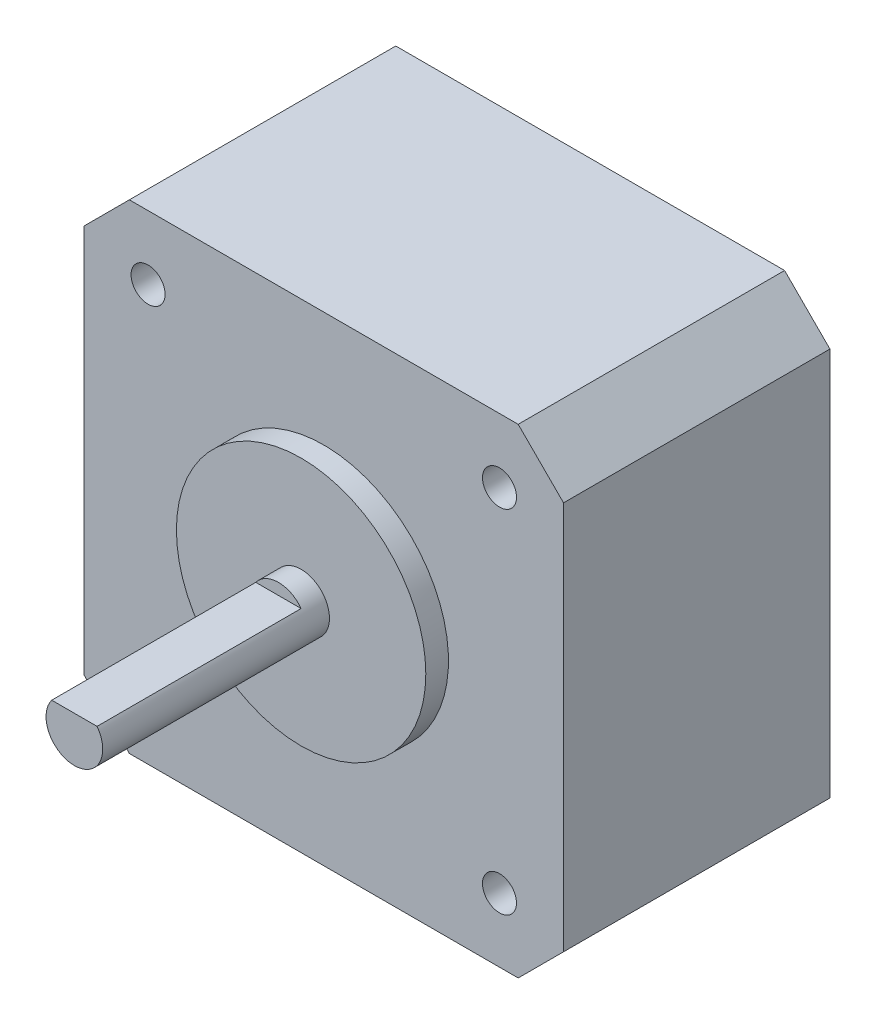
ISO-10303-21;
HEADER;
FILE_DESCRIPTION(('STEP AP214'),'2;1');
FILE_NAME('part.step','',(''),(''),'','','');
FILE_SCHEMA(('AUTOMOTIVE_DESIGN { 1 0 10303 214 1 1 1 1 }'));
ENDSEC;
DATA;
#1=APPLICATION_CONTEXT('core data for automotive mechanical design processes');
#2=APPLICATION_PROTOCOL_DEFINITION('international standard','automotive_design',2000,#1);
#3=PRODUCT_CONTEXT('',#1,'mechanical');
#4=PRODUCT('Part','Part','',(#3));
#5=PRODUCT_RELATED_PRODUCT_CATEGORY('part','',(#4));
#6=PRODUCT_DEFINITION_FORMATION('','',#4);
#7=PRODUCT_DEFINITION_CONTEXT('part definition',#1,'design');
#8=PRODUCT_DEFINITION('design','',#6,#7);
#9=PRODUCT_DEFINITION_SHAPE('','',#8);
#10=(LENGTH_UNIT() NAMED_UNIT(*) SI_UNIT(.MILLI.,.METRE.));
#11=(NAMED_UNIT(*) PLANE_ANGLE_UNIT() SI_UNIT($,.RADIAN.));
#12=(NAMED_UNIT(*) SI_UNIT($,.STERADIAN.) SOLID_ANGLE_UNIT());
#13=UNCERTAINTY_MEASURE_WITH_UNIT(LENGTH_MEASURE(1.E-05),#10,'distance_accuracy_value','');
#14=(GEOMETRIC_REPRESENTATION_CONTEXT(3) GLOBAL_UNCERTAINTY_ASSIGNED_CONTEXT((#13)) GLOBAL_UNIT_ASSIGNED_CONTEXT((#10,
#11,#12)) REPRESENTATION_CONTEXT('',''));
#15=CARTESIAN_POINT('',(0.,0.,0.));
#16=DIRECTION('',(0.,0.,1.));
#17=DIRECTION('',(1.,0.,0.));
#18=AXIS2_PLACEMENT_3D('',#15,#16,#17);
#19=CARTESIAN_POINT('',(0.,0.,45.5));
#20=DIRECTION('',(0.,0.,-1.));
#21=DIRECTION('',(-1.,0.,0.));
#22=AXIS2_PLACEMENT_3D('',#19,#20,#21);
#23=CYLINDRICAL_SURFACE('',#22,2.5);
#24=CARTESIAN_POINT('',(0.,0.,25.5));
#25=DIRECTION('',(0.,0.,1.));
#26=DIRECTION('',(1.,0.,0.));
#27=AXIS2_PLACEMENT_3D('',#24,#25,#26);
#28=CIRCLE('',#27,2.5);
#29=CARTESIAN_POINT('',(2.5,0.,25.5));
#30=VERTEX_POINT('',#29);
#31=EDGE_CURVE('E145',#30,#30,#28,.T.);
#32=ORIENTED_EDGE('',*,*,#31,.T.);
#33=EDGE_LOOP('',(#32));
#34=FACE_BOUND('',#33,.T.);
#35=DIRECTION('',(0.,0.,-1.));
#36=VECTOR('',#35,1.);
#37=CARTESIAN_POINT('',(-2.,1.5,45.5));
#38=LINE('',#37,#36);
#39=CARTESIAN_POINT('',(-2.,1.5,27.5));
#40=VERTEX_POINT('',#39);
#41=CARTESIAN_POINT('',(-2.,1.5,45.5));
#42=VERTEX_POINT('',#41);
#43=EDGE_CURVE('E54',#40,#42,#38,.F.);
#44=ORIENTED_EDGE('',*,*,#43,.F.);
#45=CARTESIAN_POINT('',(0.,0.,27.5));
#46=DIRECTION('',(0.,0.,-1.));
#47=DIRECTION('',(-1.,0.,0.));
#48=AXIS2_PLACEMENT_3D('',#45,#46,#47);
#49=CIRCLE('',#48,2.5);
#50=CARTESIAN_POINT('',(2.,1.5,27.5));
#51=VERTEX_POINT('',#50);
#52=EDGE_CURVE('E11',#40,#51,#49,.T.);
#53=ORIENTED_EDGE('',*,*,#52,.T.);
#54=DIRECTION('',(0.,0.,-1.));
#55=VECTOR('',#54,1.);
#56=CARTESIAN_POINT('',(2.,1.5,45.5));
#57=LINE('',#56,#55);
#58=CARTESIAN_POINT('',(2.,1.5,45.5));
#59=VERTEX_POINT('',#58);
#60=EDGE_CURVE('E140',#59,#51,#57,.T.);
#61=ORIENTED_EDGE('',*,*,#60,.F.);
#62=CARTESIAN_POINT('',(0.,0.,45.5));
#63=DIRECTION('',(0.,0.,1.));
#64=DIRECTION('',(1.,0.,0.));
#65=AXIS2_PLACEMENT_3D('',#62,#63,#64);
#66=CIRCLE('',#65,2.5);
#67=EDGE_CURVE('E147',#42,#59,#66,.T.);
#68=ORIENTED_EDGE('',*,*,#67,.F.);
#69=EDGE_LOOP('',(#44,#53,#61,#68));
#70=FACE_BOUND('',#69,.T.);
#71=ADVANCED_FACE('F39',(#34,#70),#23,.T.);
#72=CARTESIAN_POINT('',(0.,0.,45.5));
#73=DIRECTION('',(0.,0.,1.));
#74=DIRECTION('',(1.,0.,0.));
#75=AXIS2_PLACEMENT_3D('',#72,#73,#74);
#76=PLANE('',#75);
#77=ORIENTED_EDGE('',*,*,#67,.T.);
#78=DIRECTION('',(-1.,0.,0.));
#79=VECTOR('',#78,1.);
#80=CARTESIAN_POINT('',(0.,1.5,45.5));
#81=LINE('',#80,#79);
#82=EDGE_CURVE('E47',#59,#42,#81,.T.);
#83=ORIENTED_EDGE('',*,*,#82,.T.);
#84=EDGE_LOOP('',(#77,#83));
#85=FACE_BOUND('',#84,.T.);
#86=ADVANCED_FACE('F149',(#85),#76,.T.);
#87=CARTESIAN_POINT('',(-17.15,-21.15,23.5));
#88=DIRECTION('',(0.,1.,0.));
#89=DIRECTION('',(0.,0.,1.));
#90=AXIS2_PLACEMENT_3D('',#87,#88,#89);
#91=PLANE('',#90);
#92=DIRECTION('',(0.,0.,-1.));
#93=VECTOR('',#92,1.);
#94=CARTESIAN_POINT('',(-8.1,-21.15,0.));
#95=LINE('',#94,#93);
#96=CARTESIAN_POINT('',(-8.1,-21.15,9.2));
#97=VERTEX_POINT('',#96);
#98=CARTESIAN_POINT('',(-8.1,-21.15,0.));
#99=VERTEX_POINT('',#98);
#100=EDGE_CURVE('E62',#97,#99,#95,.T.);
#101=ORIENTED_EDGE('',*,*,#100,.F.);
#102=DIRECTION('',(-1.,0.,0.));
#103=VECTOR('',#102,1.);
#104=CARTESIAN_POINT('',(-8.1,-21.15,9.2));
#105=LINE('',#104,#103);
#106=CARTESIAN_POINT('',(8.1,-21.15,9.2));
#107=VERTEX_POINT('',#106);
#108=EDGE_CURVE('E163',#107,#97,#105,.T.);
#109=ORIENTED_EDGE('',*,*,#108,.F.);
#110=DIRECTION('',(0.,0.,1.));
#111=VECTOR('',#110,1.);
#112=CARTESIAN_POINT('',(8.1,-21.15,0.));
#113=LINE('',#112,#111);
#114=CARTESIAN_POINT('',(8.1,-21.15,0.));
#115=VERTEX_POINT('',#114);
#116=EDGE_CURVE('E171',#115,#107,#113,.T.);
#117=ORIENTED_EDGE('',*,*,#116,.F.);
#118=DIRECTION('',(1.,0.,0.));
#119=VECTOR('',#118,1.);
#120=CARTESIAN_POINT('',(-17.15,-21.15,0.));
#121=LINE('',#120,#119);
#122=CARTESIAN_POINT('',(17.15,-21.15,0.));
#123=VERTEX_POINT('',#122);
#124=EDGE_CURVE('E236',#115,#123,#121,.T.);
#125=ORIENTED_EDGE('',*,*,#124,.T.);
#126=DIRECTION('',(0.,0.,-1.));
#127=VECTOR('',#126,1.);
#128=CARTESIAN_POINT('',(17.15,-21.15,23.5));
#129=LINE('',#128,#127);
#130=CARTESIAN_POINT('',(17.15,-21.15,23.5));
#131=VERTEX_POINT('',#130);
#132=EDGE_CURVE('E257',#131,#123,#129,.T.);
#133=ORIENTED_EDGE('',*,*,#132,.F.);
#134=DIRECTION('',(1.,0.,0.));
#135=VECTOR('',#134,1.);
#136=CARTESIAN_POINT('',(-17.15,-21.15,23.5));
#137=LINE('',#136,#135);
#138=CARTESIAN_POINT('',(-17.15,-21.15,23.5));
#139=VERTEX_POINT('',#138);
#140=EDGE_CURVE('E219',#139,#131,#137,.T.);
#141=ORIENTED_EDGE('',*,*,#140,.F.);
#142=DIRECTION('',(0.,0.,-1.));
#143=VECTOR('',#142,1.);
#144=CARTESIAN_POINT('',(-17.15,-21.15,23.5));
#145=LINE('',#144,#143);
#146=CARTESIAN_POINT('',(-17.15,-21.15,0.));
#147=VERTEX_POINT('',#146);
#148=EDGE_CURVE('E260',#139,#147,#145,.T.);
#149=ORIENTED_EDGE('',*,*,#148,.T.);
#150=EDGE_CURVE('E237',#147,#99,#121,.T.);
#151=ORIENTED_EDGE('',*,*,#150,.T.);
#152=EDGE_LOOP('',(#101,#109,#117,#125,#133,#141,#149,#151));
#153=FACE_BOUND('',#152,.T.);
#154=ADVANCED_FACE('F278',(#153),#91,.F.);
#155=CARTESIAN_POINT('',(0.,0.,23.5));
#156=DIRECTION('',(0.,0.,-1.));
#157=DIRECTION('',(-1.,0.,0.));
#158=AXIS2_PLACEMENT_3D('',#155,#156,#157);
#159=PLANE('',#158);
#160=CARTESIAN_POINT('',(0.,0.,23.5));
#161=DIRECTION('',(0.,0.,-1.));
#162=DIRECTION('',(-1.,0.,0.));
#163=AXIS2_PLACEMENT_3D('',#160,#161,#162);
#164=CIRCLE('',#163,11.);
#165=CARTESIAN_POINT('',(-11.,0.,23.5));
#166=VERTEX_POINT('',#165);
#167=EDGE_CURVE('E157',#166,#166,#164,.F.);
#168=ORIENTED_EDGE('',*,*,#167,.F.);
#169=EDGE_LOOP('',(#168));
#170=FACE_BOUND('',#169,.T.);
#171=DIRECTION('',(-0.707106781186548,-0.707106781186548,0.));
#172=VECTOR('',#171,1.);
#173=CARTESIAN_POINT('',(-21.15,17.15,23.5));
#174=LINE('',#173,#172);
#175=CARTESIAN_POINT('',(-17.15,21.15,23.5));
#176=VERTEX_POINT('',#175);
#177=CARTESIAN_POINT('',(-21.15,17.15,23.5));
#178=VERTEX_POINT('',#177);
#179=EDGE_CURVE('E211',#176,#178,#174,.T.);
#180=ORIENTED_EDGE('',*,*,#179,.T.);
#181=DIRECTION('',(0.,-1.,0.));
#182=VECTOR('',#181,1.);
#183=CARTESIAN_POINT('',(-21.15,-17.15,23.5));
#184=LINE('',#183,#182);
#185=CARTESIAN_POINT('',(-21.15,-17.15,23.5));
#186=VERTEX_POINT('',#185);
#187=EDGE_CURVE('E214',#178,#186,#184,.T.);
#188=ORIENTED_EDGE('',*,*,#187,.T.);
#189=DIRECTION('',(0.707106781186548,-0.707106781186548,0.));
#190=VECTOR('',#189,1.);
#191=CARTESIAN_POINT('',(-21.15,-17.15,23.5));
#192=LINE('',#191,#190);
#193=EDGE_CURVE('E217',#186,#139,#192,.T.);
#194=ORIENTED_EDGE('',*,*,#193,.T.);
#195=ORIENTED_EDGE('',*,*,#140,.T.);
#196=DIRECTION('',(0.707106781186548,0.707106781186548,0.));
#197=VECTOR('',#196,1.);
#198=CARTESIAN_POINT('',(17.15,-21.15,23.5));
#199=LINE('',#198,#197);
#200=CARTESIAN_POINT('',(21.15,-17.15,23.5));
#201=VERTEX_POINT('',#200);
#202=EDGE_CURVE('E221',#131,#201,#199,.T.);
#203=ORIENTED_EDGE('',*,*,#202,.T.);
#204=DIRECTION('',(0.,1.,0.));
#205=VECTOR('',#204,1.);
#206=CARTESIAN_POINT('',(21.15,-17.15,23.5));
#207=LINE('',#206,#205);
#208=CARTESIAN_POINT('',(21.15,17.15,23.5));
#209=VERTEX_POINT('',#208);
#210=EDGE_CURVE('E223',#201,#209,#207,.T.);
#211=ORIENTED_EDGE('',*,*,#210,.T.);
#212=DIRECTION('',(-0.707106781186548,0.707106781186548,0.));
#213=VECTOR('',#212,1.);
#214=CARTESIAN_POINT('',(17.15,21.15,23.5));
#215=LINE('',#214,#213);
#216=CARTESIAN_POINT('',(17.15,21.15,23.5));
#217=VERTEX_POINT('',#216);
#218=EDGE_CURVE('E225',#209,#217,#215,.T.);
#219=ORIENTED_EDGE('',*,*,#218,.T.);
#220=DIRECTION('',(-1.,0.,0.));
#221=VECTOR('',#220,1.);
#222=CARTESIAN_POINT('',(-17.15,21.15,23.5));
#223=LINE('',#222,#221);
#224=EDGE_CURVE('E227',#217,#176,#223,.T.);
#225=ORIENTED_EDGE('',*,*,#224,.T.);
#226=EDGE_LOOP('',(#180,#188,#194,#195,#203,#211,#219,#225));
#227=FACE_BOUND('',#226,.T.);
#228=CARTESIAN_POINT('',(-15.5,15.5,23.5));
#229=DIRECTION('',(0.,0.,1.));
#230=DIRECTION('',(1.,0.,0.));
#231=AXIS2_PLACEMENT_3D('',#228,#229,#230);
#232=CIRCLE('',#231,1.5);
#233=CARTESIAN_POINT('',(-14.,15.5,23.5));
#234=VERTEX_POINT('',#233);
#235=EDGE_CURVE('E205',#234,#234,#232,.T.);
#236=ORIENTED_EDGE('',*,*,#235,.F.);
#237=EDGE_LOOP('',(#236));
#238=FACE_BOUND('',#237,.T.);
#239=CARTESIAN_POINT('',(15.5,15.5,23.5));
#240=DIRECTION('',(0.,0.,1.));
#241=DIRECTION('',(1.,0.,0.));
#242=AXIS2_PLACEMENT_3D('',#239,#240,#241);
#243=CIRCLE('',#242,1.5);
#244=CARTESIAN_POINT('',(17.,15.5,23.5));
#245=VERTEX_POINT('',#244);
#246=EDGE_CURVE('E199',#245,#245,#243,.T.);
#247=ORIENTED_EDGE('',*,*,#246,.F.);
#248=EDGE_LOOP('',(#247));
#249=FACE_BOUND('',#248,.T.);
#250=CARTESIAN_POINT('',(15.5,-15.5,23.5));
#251=DIRECTION('',(0.,0.,1.));
#252=DIRECTION('',(1.,0.,0.));
#253=AXIS2_PLACEMENT_3D('',#250,#251,#252);
#254=CIRCLE('',#253,1.5);
#255=CARTESIAN_POINT('',(17.,-15.5,23.5));
#256=VERTEX_POINT('',#255);
#257=EDGE_CURVE('E193',#256,#256,#254,.T.);
#258=ORIENTED_EDGE('',*,*,#257,.F.);
#259=EDGE_LOOP('',(#258));
#260=FACE_BOUND('',#259,.T.);
#261=CARTESIAN_POINT('',(-15.5,-15.5,23.5));
#262=DIRECTION('',(0.,0.,1.));
#263=DIRECTION('',(1.,0.,0.));
#264=AXIS2_PLACEMENT_3D('',#261,#262,#263);
#265=CIRCLE('',#264,1.5);
#266=CARTESIAN_POINT('',(-14.,-15.5,23.5));
#267=VERTEX_POINT('',#266);
#268=EDGE_CURVE('E187',#267,#267,#265,.T.);
#269=ORIENTED_EDGE('',*,*,#268,.F.);
#270=EDGE_LOOP('',(#269));
#271=FACE_BOUND('',#270,.T.);
#272=ADVANCED_FACE('F274',(#170,#227,#238,#249,#260,#271),#159,.F.);
#273=CARTESIAN_POINT('',(0.,0.,0.));
#274=DIRECTION('',(0.,0.,-1.));
#275=DIRECTION('',(-1.,0.,0.));
#276=AXIS2_PLACEMENT_3D('',#273,#274,#275);
#277=PLANE('',#276);
#278=CARTESIAN_POINT('',(15.5,-15.5,0.));
#279=DIRECTION('',(0.,0.,1.));
#280=DIRECTION('',(1.,0.,0.));
#281=AXIS2_PLACEMENT_3D('',#278,#279,#280);
#282=CIRCLE('',#281,1.5);
#283=CARTESIAN_POINT('',(17.,-15.5,0.));
#284=VERTEX_POINT('',#283);
#285=EDGE_CURVE('E190',#284,#284,#282,.T.);
#286=ORIENTED_EDGE('',*,*,#285,.T.);
#287=EDGE_LOOP('',(#286));
#288=FACE_BOUND('',#287,.T.);
#289=CARTESIAN_POINT('',(-15.5,15.5,0.));
#290=DIRECTION('',(0.,0.,1.));
#291=DIRECTION('',(1.,0.,0.));
#292=AXIS2_PLACEMENT_3D('',#289,#290,#291);
#293=CIRCLE('',#292,1.5);
#294=CARTESIAN_POINT('',(-14.,15.5,0.));
#295=VERTEX_POINT('',#294);
#296=EDGE_CURVE('E202',#295,#295,#293,.T.);
#297=ORIENTED_EDGE('',*,*,#296,.T.);
#298=EDGE_LOOP('',(#297));
#299=FACE_BOUND('',#298,.T.);
#300=DIRECTION('',(-0.707106781186548,-0.707106781186548,0.));
#301=VECTOR('',#300,1.);
#302=CARTESIAN_POINT('',(-21.15,17.15,0.));
#303=LINE('',#302,#301);
#304=CARTESIAN_POINT('',(-17.15,21.15,0.));
#305=VERTEX_POINT('',#304);
#306=CARTESIAN_POINT('',(-21.15,17.15,0.));
#307=VERTEX_POINT('',#306);
#308=EDGE_CURVE('E208',#305,#307,#303,.T.);
#309=ORIENTED_EDGE('',*,*,#308,.F.);
#310=DIRECTION('',(-1.,0.,0.));
#311=VECTOR('',#310,1.);
#312=CARTESIAN_POINT('',(-17.15,21.15,0.));
#313=LINE('',#312,#311);
#314=CARTESIAN_POINT('',(17.15,21.15,0.));
#315=VERTEX_POINT('',#314);
#316=EDGE_CURVE('E215',#315,#305,#313,.T.);
#317=ORIENTED_EDGE('',*,*,#316,.F.);
#318=DIRECTION('',(-0.707106781186548,0.707106781186548,0.));
#319=VECTOR('',#318,1.);
#320=CARTESIAN_POINT('',(17.15,21.15,0.));
#321=LINE('',#320,#319);
#322=CARTESIAN_POINT('',(21.15,17.15,0.));
#323=VERTEX_POINT('',#322);
#324=EDGE_CURVE('E243',#323,#315,#321,.T.);
#325=ORIENTED_EDGE('',*,*,#324,.F.);
#326=DIRECTION('',(0.,1.,0.));
#327=VECTOR('',#326,1.);
#328=CARTESIAN_POINT('',(21.15,-17.15,0.));
#329=LINE('',#328,#327);
#330=CARTESIAN_POINT('',(21.15,-17.15,0.));
#331=VERTEX_POINT('',#330);
#332=EDGE_CURVE('E241',#331,#323,#329,.T.);
#333=ORIENTED_EDGE('',*,*,#332,.F.);
#334=DIRECTION('',(0.707106781186548,0.707106781186548,0.));
#335=VECTOR('',#334,1.);
#336=CARTESIAN_POINT('',(17.15,-21.15,0.));
#337=LINE('',#336,#335);
#338=EDGE_CURVE('E239',#123,#331,#337,.T.);
#339=ORIENTED_EDGE('',*,*,#338,.F.);
#340=ORIENTED_EDGE('',*,*,#124,.F.);
#341=DIRECTION('',(0.,1.,0.));
#342=VECTOR('',#341,1.);
#343=CARTESIAN_POINT('',(8.1,-26.65,0.));
#344=LINE('',#343,#342);
#345=CARTESIAN_POINT('',(8.1,-26.65,0.));
#346=VERTEX_POINT('',#345);
#347=EDGE_CURVE('E180',#346,#115,#344,.T.);
#348=ORIENTED_EDGE('',*,*,#347,.F.);
#349=DIRECTION('',(1.,0.,0.));
#350=VECTOR('',#349,1.);
#351=CARTESIAN_POINT('',(-8.1,-26.65,0.));
#352=LINE('',#351,#350);
#353=CARTESIAN_POINT('',(-8.1,-26.65,0.));
#354=VERTEX_POINT('',#353);
#355=EDGE_CURVE('E162',#354,#346,#352,.T.);
#356=ORIENTED_EDGE('',*,*,#355,.F.);
#357=DIRECTION('',(0.,1.,0.));
#358=VECTOR('',#357,1.);
#359=CARTESIAN_POINT('',(-8.1,-26.65,0.));
#360=LINE('',#359,#358);
#361=EDGE_CURVE('E183',#354,#99,#360,.T.);
#362=ORIENTED_EDGE('',*,*,#361,.T.);
#363=ORIENTED_EDGE('',*,*,#150,.F.);
#364=DIRECTION('',(0.707106781186548,-0.707106781186548,0.));
#365=VECTOR('',#364,1.);
#366=CARTESIAN_POINT('',(-21.15,-17.15,0.));
#367=LINE('',#366,#365);
#368=CARTESIAN_POINT('',(-21.15,-17.15,0.));
#369=VERTEX_POINT('',#368);
#370=EDGE_CURVE('E234',#369,#147,#367,.T.);
#371=ORIENTED_EDGE('',*,*,#370,.F.);
#372=DIRECTION('',(0.,-1.,0.));
#373=VECTOR('',#372,1.);
#374=CARTESIAN_POINT('',(-21.15,-17.15,0.));
#375=LINE('',#374,#373);
#376=EDGE_CURVE('E232',#307,#369,#375,.T.);
#377=ORIENTED_EDGE('',*,*,#376,.F.);
#378=EDGE_LOOP('',(#309,#317,#325,#333,#339,#340,#348,#356,#362,#363,#371,#377));
#379=FACE_BOUND('',#378,.T.);
#380=CARTESIAN_POINT('',(15.5,15.5,0.));
#381=DIRECTION('',(0.,0.,1.));
#382=DIRECTION('',(1.,0.,0.));
#383=AXIS2_PLACEMENT_3D('',#380,#381,#382);
#384=CIRCLE('',#383,1.5);
#385=CARTESIAN_POINT('',(17.,15.5,0.));
#386=VERTEX_POINT('',#385);
#387=EDGE_CURVE('E196',#386,#386,#384,.T.);
#388=ORIENTED_EDGE('',*,*,#387,.T.);
#389=EDGE_LOOP('',(#388));
#390=FACE_BOUND('',#389,.T.);
#391=CARTESIAN_POINT('',(-15.5,-15.5,0.));
#392=DIRECTION('',(0.,0.,1.));
#393=DIRECTION('',(1.,0.,0.));
#394=AXIS2_PLACEMENT_3D('',#391,#392,#393);
#395=CIRCLE('',#394,1.5);
#396=CARTESIAN_POINT('',(-14.,-15.5,0.));
#397=VERTEX_POINT('',#396);
#398=EDGE_CURVE('E186',#397,#397,#395,.T.);
#399=ORIENTED_EDGE('',*,*,#398,.T.);
#400=EDGE_LOOP('',(#399));
#401=FACE_BOUND('',#400,.T.);
#402=ADVANCED_FACE('F277',(#288,#299,#379,#390,#401),#277,.T.);
#403=CARTESIAN_POINT('',(-21.15,17.15,23.5));
#404=DIRECTION('',(0.707106781186547,-0.707106781186547,0.));
#405=DIRECTION('',(0.707106781186548,0.707106781186548,0.));
#406=AXIS2_PLACEMENT_3D('',#403,#404,#405);
#407=PLANE('',#406);
#408=ORIENTED_EDGE('',*,*,#308,.T.);
#409=DIRECTION('',(0.,0.,-1.));
#410=VECTOR('',#409,1.);
#411=CARTESIAN_POINT('',(-21.15,17.15,23.5));
#412=LINE('',#411,#410);
#413=EDGE_CURVE('E266',#178,#307,#412,.T.);
#414=ORIENTED_EDGE('',*,*,#413,.F.);
#415=ORIENTED_EDGE('',*,*,#179,.F.);
#416=DIRECTION('',(0.,0.,-1.));
#417=VECTOR('',#416,1.);
#418=CARTESIAN_POINT('',(-17.15,21.15,23.5));
#419=LINE('',#418,#417);
#420=EDGE_CURVE('E229',#176,#305,#419,.T.);
#421=ORIENTED_EDGE('',*,*,#420,.T.);
#422=EDGE_LOOP('',(#408,#414,#415,#421));
#423=FACE_BOUND('',#422,.T.);
#424=ADVANCED_FACE('F41',(#423),#407,.F.);
#425=CARTESIAN_POINT('',(-21.15,-17.15,23.5));
#426=DIRECTION('',(1.,0.,0.));
#427=DIRECTION('',(0.,0.,-1.));
#428=AXIS2_PLACEMENT_3D('',#425,#426,#427);
#429=PLANE('',#428);
#430=ORIENTED_EDGE('',*,*,#376,.T.);
#431=DIRECTION('',(0.,0.,-1.));
#432=VECTOR('',#431,1.);
#433=CARTESIAN_POINT('',(-21.15,-17.15,23.5));
#434=LINE('',#433,#432);
#435=EDGE_CURVE('E263',#186,#369,#434,.T.);
#436=ORIENTED_EDGE('',*,*,#435,.F.);
#437=ORIENTED_EDGE('',*,*,#187,.F.);
#438=ORIENTED_EDGE('',*,*,#413,.T.);
#439=EDGE_LOOP('',(#430,#436,#437,#438));
#440=FACE_BOUND('',#439,.T.);
#441=ADVANCED_FACE('F305',(#440),#429,.F.);
#442=CARTESIAN_POINT('',(-21.15,-17.15,23.5));
#443=DIRECTION('',(0.707106781186547,0.707106781186547,0.));
#444=DIRECTION('',(-0.707106781186548,0.707106781186548,0.));
#445=AXIS2_PLACEMENT_3D('',#442,#443,#444);
#446=PLANE('',#445);
#447=ORIENTED_EDGE('',*,*,#370,.T.);
#448=ORIENTED_EDGE('',*,*,#148,.F.);
#449=ORIENTED_EDGE('',*,*,#193,.F.);
#450=ORIENTED_EDGE('',*,*,#435,.T.);
#451=EDGE_LOOP('',(#447,#448,#449,#450));
#452=FACE_BOUND('',#451,.T.);
#453=ADVANCED_FACE('F396',(#452),#446,.F.);
#454=CARTESIAN_POINT('',(17.15,-21.15,23.5));
#455=DIRECTION('',(-0.707106781186547,0.707106781186547,0.));
#456=DIRECTION('',(-0.707106781186548,-0.707106781186548,0.));
#457=AXIS2_PLACEMENT_3D('',#454,#455,#456);
#458=PLANE('',#457);
#459=ORIENTED_EDGE('',*,*,#338,.T.);
#460=DIRECTION('',(0.,0.,-1.));
#461=VECTOR('',#460,1.);
#462=CARTESIAN_POINT('',(21.15,-17.15,23.5));
#463=LINE('',#462,#461);
#464=EDGE_CURVE('E254',#201,#331,#463,.T.);
#465=ORIENTED_EDGE('',*,*,#464,.F.);
#466=ORIENTED_EDGE('',*,*,#202,.F.);
#467=ORIENTED_EDGE('',*,*,#132,.T.);
#468=EDGE_LOOP('',(#459,#465,#466,#467));
#469=FACE_BOUND('',#468,.T.);
#470=ADVANCED_FACE('F382',(#469),#458,.F.);
#471=CARTESIAN_POINT('',(21.15,-17.15,23.5));
#472=DIRECTION('',(-1.,0.,0.));
#473=DIRECTION('',(0.,0.,1.));
#474=AXIS2_PLACEMENT_3D('',#471,#472,#473);
#475=PLANE('',#474);
#476=ORIENTED_EDGE('',*,*,#332,.T.);
#477=DIRECTION('',(0.,0.,-1.));
#478=VECTOR('',#477,1.);
#479=CARTESIAN_POINT('',(21.15,17.15,23.5));
#480=LINE('',#479,#478);
#481=EDGE_CURVE('E251',#209,#323,#480,.T.);
#482=ORIENTED_EDGE('',*,*,#481,.F.);
#483=ORIENTED_EDGE('',*,*,#210,.F.);
#484=ORIENTED_EDGE('',*,*,#464,.T.);
#485=EDGE_LOOP('',(#476,#482,#483,#484));
#486=FACE_BOUND('',#485,.T.);
#487=ADVANCED_FACE('F377',(#486),#475,.F.);
#488=CARTESIAN_POINT('',(17.15,21.15,23.5));
#489=DIRECTION('',(-0.707106781186547,-0.707106781186547,0.));
#490=DIRECTION('',(0.707106781186548,-0.707106781186548,0.));
#491=AXIS2_PLACEMENT_3D('',#488,#489,#490);
#492=PLANE('',#491);
#493=ORIENTED_EDGE('',*,*,#324,.T.);
#494=DIRECTION('',(0.,0.,-1.));
#495=VECTOR('',#494,1.);
#496=CARTESIAN_POINT('',(17.15,21.15,23.5));
#497=LINE('',#496,#495);
#498=EDGE_CURVE('E248',#217,#315,#497,.T.);
#499=ORIENTED_EDGE('',*,*,#498,.F.);
#500=ORIENTED_EDGE('',*,*,#218,.F.);
#501=ORIENTED_EDGE('',*,*,#481,.T.);
#502=EDGE_LOOP('',(#493,#499,#500,#501));
#503=FACE_BOUND('',#502,.T.);
#504=ADVANCED_FACE('F355',(#503),#492,.F.);
#505=CARTESIAN_POINT('',(-17.15,21.15,23.5));
#506=DIRECTION('',(0.,-1.,0.));
#507=DIRECTION('',(0.,0.,-1.));
#508=AXIS2_PLACEMENT_3D('',#505,#506,#507);
#509=PLANE('',#508);
#510=ORIENTED_EDGE('',*,*,#316,.T.);
#511=ORIENTED_EDGE('',*,*,#420,.F.);
#512=ORIENTED_EDGE('',*,*,#224,.F.);
#513=ORIENTED_EDGE('',*,*,#498,.T.);
#514=EDGE_LOOP('',(#510,#511,#512,#513));
#515=FACE_BOUND('',#514,.T.);
#516=ADVANCED_FACE('F350',(#515),#509,.F.);
#517=CARTESIAN_POINT('',(-15.5,15.5,23.5));
#518=DIRECTION('',(0.,0.,-1.));
#519=DIRECTION('',(-1.,0.,0.));
#520=AXIS2_PLACEMENT_3D('',#517,#518,#519);
#521=CYLINDRICAL_SURFACE('',#520,1.5);
#522=ORIENTED_EDGE('',*,*,#235,.T.);
#523=EDGE_LOOP('',(#522));
#524=FACE_BOUND('',#523,.T.);
#525=ORIENTED_EDGE('',*,*,#296,.F.);
#526=EDGE_LOOP('',(#525));
#527=FACE_BOUND('',#526,.T.);
#528=ADVANCED_FACE('F347',(#524,#527),#521,.F.);
#529=CARTESIAN_POINT('',(15.5,15.5,23.5));
#530=DIRECTION('',(0.,0.,-1.));
#531=DIRECTION('',(-1.,0.,0.));
#532=AXIS2_PLACEMENT_3D('',#529,#530,#531);
#533=CYLINDRICAL_SURFACE('',#532,1.5);
#534=ORIENTED_EDGE('',*,*,#246,.T.);
#535=EDGE_LOOP('',(#534));
#536=FACE_BOUND('',#535,.T.);
#537=ORIENTED_EDGE('',*,*,#387,.F.);
#538=EDGE_LOOP('',(#537));
#539=FACE_BOUND('',#538,.T.);
#540=ADVANCED_FACE('F343',(#536,#539),#533,.F.);
#541=CARTESIAN_POINT('',(15.5,-15.5,23.5));
#542=DIRECTION('',(0.,0.,-1.));
#543=DIRECTION('',(-1.,0.,0.));
#544=AXIS2_PLACEMENT_3D('',#541,#542,#543);
#545=CYLINDRICAL_SURFACE('',#544,1.5);
#546=ORIENTED_EDGE('',*,*,#257,.T.);
#547=EDGE_LOOP('',(#546));
#548=FACE_BOUND('',#547,.T.);
#549=ORIENTED_EDGE('',*,*,#285,.F.);
#550=EDGE_LOOP('',(#549));
#551=FACE_BOUND('',#550,.T.);
#552=ADVANCED_FACE('F295',(#548,#551),#545,.F.);
#553=CARTESIAN_POINT('',(-15.5,-15.5,23.5));
#554=DIRECTION('',(0.,0.,-1.));
#555=DIRECTION('',(-1.,0.,0.));
#556=AXIS2_PLACEMENT_3D('',#553,#554,#555);
#557=CYLINDRICAL_SURFACE('',#556,1.5);
#558=ORIENTED_EDGE('',*,*,#268,.T.);
#559=EDGE_LOOP('',(#558));
#560=FACE_BOUND('',#559,.T.);
#561=ORIENTED_EDGE('',*,*,#398,.F.);
#562=EDGE_LOOP('',(#561));
#563=FACE_BOUND('',#562,.T.);
#564=ADVANCED_FACE('F291',(#560,#563),#557,.F.);
#565=CARTESIAN_POINT('',(-8.1,-26.65,0.));
#566=DIRECTION('',(1.,0.,0.));
#567=DIRECTION('',(0.,0.,-1.));
#568=AXIS2_PLACEMENT_3D('',#565,#566,#567);
#569=PLANE('',#568);
#570=ORIENTED_EDGE('',*,*,#100,.T.);
#571=ORIENTED_EDGE('',*,*,#361,.F.);
#572=DIRECTION('',(0.,0.,-1.));
#573=VECTOR('',#572,1.);
#574=CARTESIAN_POINT('',(-8.1,-26.65,0.));
#575=LINE('',#574,#573);
#576=CARTESIAN_POINT('',(-8.1,-26.65,9.2));
#577=VERTEX_POINT('',#576);
#578=EDGE_CURVE('E159',#577,#354,#575,.T.);
#579=ORIENTED_EDGE('',*,*,#578,.F.);
#580=DIRECTION('',(0.,1.,0.));
#581=VECTOR('',#580,1.);
#582=CARTESIAN_POINT('',(-8.1,-26.65,9.2));
#583=LINE('',#582,#581);
#584=EDGE_CURVE('E169',#577,#97,#583,.T.);
#585=ORIENTED_EDGE('',*,*,#584,.T.);
#586=EDGE_LOOP('',(#570,#571,#579,#585));
#587=FACE_BOUND('',#586,.T.);
#588=ADVANCED_FACE('F294',(#587),#569,.F.);
#589=CARTESIAN_POINT('',(8.1,-26.65,0.));
#590=DIRECTION('',(-1.,0.,0.));
#591=DIRECTION('',(0.,0.,1.));
#592=AXIS2_PLACEMENT_3D('',#589,#590,#591);
#593=PLANE('',#592);
#594=ORIENTED_EDGE('',*,*,#116,.T.);
#595=DIRECTION('',(0.,1.,0.));
#596=VECTOR('',#595,1.);
#597=CARTESIAN_POINT('',(8.1,-26.65,9.2));
#598=LINE('',#597,#596);
#599=CARTESIAN_POINT('',(8.1,-26.65,9.2));
#600=VERTEX_POINT('',#599);
#601=EDGE_CURVE('E177',#600,#107,#598,.T.);
#602=ORIENTED_EDGE('',*,*,#601,.F.);
#603=DIRECTION('',(0.,0.,1.));
#604=VECTOR('',#603,1.);
#605=CARTESIAN_POINT('',(8.1,-26.65,0.));
#606=LINE('',#605,#604);
#607=EDGE_CURVE('E165',#346,#600,#606,.T.);
#608=ORIENTED_EDGE('',*,*,#607,.F.);
#609=ORIENTED_EDGE('',*,*,#347,.T.);
#610=EDGE_LOOP('',(#594,#602,#608,#609));
#611=FACE_BOUND('',#610,.T.);
#612=ADVANCED_FACE('F333',(#611),#593,.F.);
#613=CARTESIAN_POINT('',(-8.1,-26.65,9.2));
#614=DIRECTION('',(0.,0.,-1.));
#615=DIRECTION('',(-1.,0.,0.));
#616=AXIS2_PLACEMENT_3D('',#613,#614,#615);
#617=PLANE('',#616);
#618=ORIENTED_EDGE('',*,*,#108,.T.);
#619=ORIENTED_EDGE('',*,*,#584,.F.);
#620=DIRECTION('',(-1.,0.,0.));
#621=VECTOR('',#620,1.);
#622=CARTESIAN_POINT('',(-8.1,-26.65,9.2));
#623=LINE('',#622,#621);
#624=EDGE_CURVE('E167',#600,#577,#623,.T.);
#625=ORIENTED_EDGE('',*,*,#624,.F.);
#626=ORIENTED_EDGE('',*,*,#601,.T.);
#627=EDGE_LOOP('',(#618,#619,#625,#626));
#628=FACE_BOUND('',#627,.T.);
#629=ADVANCED_FACE('F329',(#628),#617,.F.);
#630=CARTESIAN_POINT('',(0.,-26.65,0.));
#631=DIRECTION('',(0.,1.,0.));
#632=DIRECTION('',(0.,0.,1.));
#633=AXIS2_PLACEMENT_3D('',#630,#631,#632);
#634=PLANE('',#633);
#635=ORIENTED_EDGE('',*,*,#578,.T.);
#636=ORIENTED_EDGE('',*,*,#355,.T.);
#637=ORIENTED_EDGE('',*,*,#607,.T.);
#638=ORIENTED_EDGE('',*,*,#624,.T.);
#639=EDGE_LOOP('',(#635,#636,#637,#638));
#640=FACE_BOUND('',#639,.T.);
#641=ADVANCED_FACE('F325',(#640),#634,.F.);
#642=CARTESIAN_POINT('',(0.,0.,25.5));
#643=DIRECTION('',(0.,0.,-1.));
#644=DIRECTION('',(-1.,0.,0.));
#645=AXIS2_PLACEMENT_3D('',#642,#643,#644);
#646=CYLINDRICAL_SURFACE('',#645,11.);
#647=CARTESIAN_POINT('',(0.,0.,25.5));
#648=DIRECTION('',(0.,0.,1.));
#649=DIRECTION('',(1.,0.,0.));
#650=AXIS2_PLACEMENT_3D('',#647,#648,#649);
#651=CIRCLE('',#650,11.);
#652=CARTESIAN_POINT('',(11.,0.,25.5));
#653=VERTEX_POINT('',#652);
#654=EDGE_CURVE('E150',#653,#653,#651,.T.);
#655=ORIENTED_EDGE('',*,*,#654,.F.);
#656=EDGE_LOOP('',(#655));
#657=FACE_BOUND('',#656,.T.);
#658=ORIENTED_EDGE('',*,*,#167,.T.);
#659=EDGE_LOOP('',(#658));
#660=FACE_BOUND('',#659,.T.);
#661=ADVANCED_FACE('F272',(#657,#660),#646,.T.);
#662=CARTESIAN_POINT('',(0.,0.,25.5));
#663=DIRECTION('',(0.,0.,1.));
#664=DIRECTION('',(1.,0.,0.));
#665=AXIS2_PLACEMENT_3D('',#662,#663,#664);
#666=PLANE('',#665);
#667=ORIENTED_EDGE('',*,*,#31,.F.);
#668=EDGE_LOOP('',(#667));
#669=FACE_BOUND('',#668,.T.);
#670=ORIENTED_EDGE('',*,*,#654,.T.);
#671=EDGE_LOOP('',(#670));
#672=FACE_BOUND('',#671,.T.);
#673=ADVANCED_FACE('F318',(#669,#672),#666,.T.);
#674=CARTESIAN_POINT('',(2.5,1.5,27.5));
#675=DIRECTION('',(0.,0.,-1.));
#676=DIRECTION('',(-1.,0.,0.));
#677=AXIS2_PLACEMENT_3D('',#674,#675,#676);
#678=PLANE('',#677);
#679=DIRECTION('',(-1.,0.,0.));
#680=VECTOR('',#679,1.);
#681=CARTESIAN_POINT('',(2.5,1.5,27.5));
#682=LINE('',#681,#680);
#683=EDGE_CURVE('E579',#51,#40,#682,.T.);
#684=ORIENTED_EDGE('',*,*,#683,.F.);
#685=ORIENTED_EDGE('',*,*,#52,.F.);
#686=EDGE_LOOP('',(#684,#685));
#687=FACE_BOUND('',#686,.T.);
#688=ADVANCED_FACE('F321',(#687),#678,.F.);
#689=CARTESIAN_POINT('',(0.,1.5,0.));
#690=DIRECTION('',(0.,1.,0.));
#691=DIRECTION('',(0.,0.,1.));
#692=AXIS2_PLACEMENT_3D('',#689,#690,#691);
#693=PLANE('',#692);
#694=ORIENTED_EDGE('',*,*,#60,.T.);
#695=ORIENTED_EDGE('',*,*,#683,.T.);
#696=ORIENTED_EDGE('',*,*,#43,.T.);
#697=ORIENTED_EDGE('',*,*,#82,.F.);
#698=EDGE_LOOP('',(#694,#695,#696,#697));
#699=FACE_BOUND('',#698,.T.);
#700=ADVANCED_FACE('F139',(#699),#693,.T.);
#701=CLOSED_SHELL('',(#71,#86,#154,#272,#402,#424,#441,#453,#470,#487,#504,#516,#528,#540,#552,
#564,#588,#612,#629,#641,#661,#673,#688,#700));
#702=MANIFOLD_SOLID_BREP('B2',#701);
#703=ADVANCED_BREP_SHAPE_REPRESENTATION('',(#18,#702),#14);
#704=SHAPE_DEFINITION_REPRESENTATION(#9,#703);
ENDSEC;
END-ISO-10303-21;
